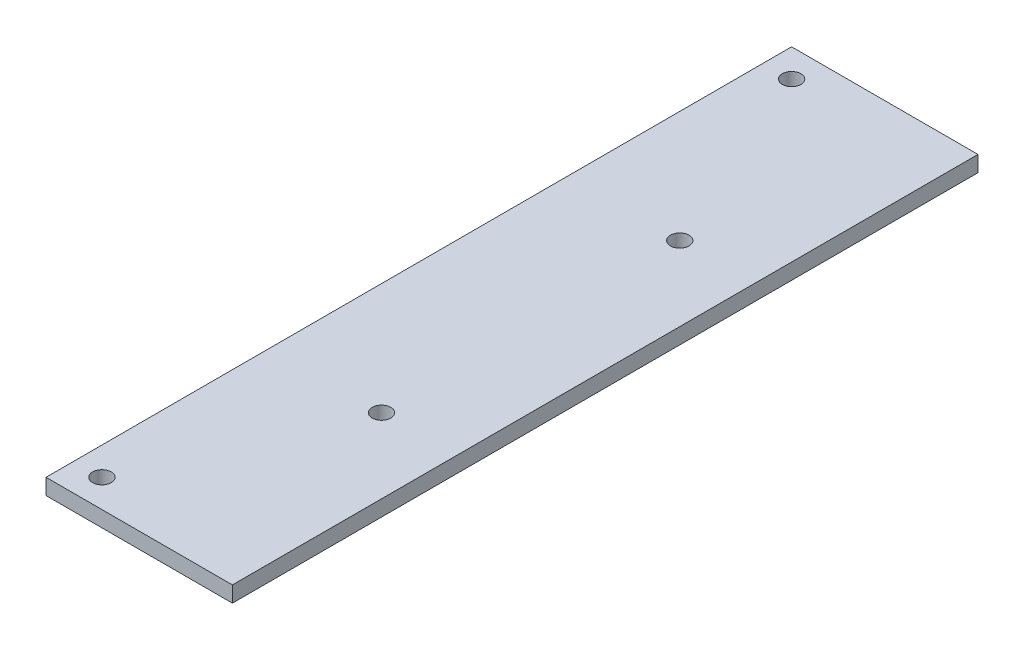
ISO-10303-21;
HEADER;
FILE_DESCRIPTION(('STEP AP214'),'2;1');
FILE_NAME('part.step','',(''),(''),'','','');
FILE_SCHEMA(('AUTOMOTIVE_DESIGN { 1 0 10303 214 1 1 1 1 }'));
ENDSEC;
DATA;
#1=APPLICATION_CONTEXT('core data for automotive mechanical design processes');
#2=APPLICATION_PROTOCOL_DEFINITION('international standard','automotive_design',2000,#1);
#3=PRODUCT_CONTEXT('',#1,'mechanical');
#4=PRODUCT('Part','Part','',(#3));
#5=PRODUCT_RELATED_PRODUCT_CATEGORY('part','',(#4));
#6=PRODUCT_DEFINITION_FORMATION('','',#4);
#7=PRODUCT_DEFINITION_CONTEXT('part definition',#1,'design');
#8=PRODUCT_DEFINITION('design','',#6,#7);
#9=PRODUCT_DEFINITION_SHAPE('','',#8);
#10=(LENGTH_UNIT() NAMED_UNIT(*) SI_UNIT(.MILLI.,.METRE.));
#11=(NAMED_UNIT(*) PLANE_ANGLE_UNIT() SI_UNIT($,.RADIAN.));
#12=(NAMED_UNIT(*) SI_UNIT($,.STERADIAN.) SOLID_ANGLE_UNIT());
#13=UNCERTAINTY_MEASURE_WITH_UNIT(LENGTH_MEASURE(1.E-05),#10,'distance_accuracy_value','');
#14=(GEOMETRIC_REPRESENTATION_CONTEXT(3) GLOBAL_UNCERTAINTY_ASSIGNED_CONTEXT((#13)) GLOBAL_UNIT_ASSIGNED_CONTEXT((#10,
#11,#12)) REPRESENTATION_CONTEXT('',''));
#15=CARTESIAN_POINT('',(0.,0.,0.));
#16=DIRECTION('',(0.,0.,1.));
#17=DIRECTION('',(1.,0.,0.));
#18=AXIS2_PLACEMENT_3D('',#15,#16,#17);
#19=CARTESIAN_POINT('',(0.,1.7,0.));
#20=DIRECTION('',(0.,-1.,0.));
#21=DIRECTION('',(0.,0.,-1.));
#22=AXIS2_PLACEMENT_3D('',#19,#20,#21);
#23=PLANE('',#22);
#24=DIRECTION('',(0.,0.,-1.));
#25=VECTOR('',#24,1.);
#26=CARTESIAN_POINT('',(9.99999999999999,1.7,40.));
#27=LINE('',#26,#25);
#28=CARTESIAN_POINT('',(9.99999999999999,1.7,40.));
#29=VERTEX_POINT('',#28);
#30=CARTESIAN_POINT('',(9.99999999999999,1.7,-40.));
#31=VERTEX_POINT('',#30);
#32=EDGE_CURVE('E158',#29,#31,#27,.T.);
#33=ORIENTED_EDGE('',*,*,#32,.T.);
#34=DIRECTION('',(-1.,0.,0.));
#35=VECTOR('',#34,1.);
#36=CARTESIAN_POINT('',(-10.,1.7,-40.));
#37=LINE('',#36,#35);
#38=CARTESIAN_POINT('',(-10.,1.7,-40.));
#39=VERTEX_POINT('',#38);
#40=EDGE_CURVE('E161',#31,#39,#37,.T.);
#41=ORIENTED_EDGE('',*,*,#40,.T.);
#42=DIRECTION('',(0.,0.,1.));
#43=VECTOR('',#42,1.);
#44=CARTESIAN_POINT('',(-10.,1.7,40.));
#45=LINE('',#44,#43);
#46=CARTESIAN_POINT('',(-10.,1.7,40.));
#47=VERTEX_POINT('',#46);
#48=EDGE_CURVE('E164',#39,#47,#45,.T.);
#49=ORIENTED_EDGE('',*,*,#48,.T.);
#50=DIRECTION('',(1.,0.,0.));
#51=VECTOR('',#50,1.);
#52=CARTESIAN_POINT('',(-10.,1.7,40.));
#53=LINE('',#52,#51);
#54=EDGE_CURVE('E166',#47,#29,#53,.T.);
#55=ORIENTED_EDGE('',*,*,#54,.T.);
#56=EDGE_LOOP('',(#33,#41,#49,#55));
#57=FACE_BOUND('',#56,.T.);
#58=CARTESIAN_POINT('',(2.,1.7,-16.));
#59=DIRECTION('',(0.,1.,0.));
#60=DIRECTION('',(0.,0.,1.));
#61=AXIS2_PLACEMENT_3D('',#58,#59,#60);
#62=CIRCLE('',#61,0.999999999999998);
#63=CARTESIAN_POINT('',(2.,1.7,-15.));
#64=VERTEX_POINT('',#63);
#65=EDGE_CURVE('E152',#64,#64,#62,.T.);
#66=ORIENTED_EDGE('',*,*,#65,.F.);
#67=EDGE_LOOP('',(#66));
#68=FACE_BOUND('',#67,.T.);
#69=CARTESIAN_POINT('',(2.,1.7,16.));
#70=DIRECTION('',(0.,1.,0.));
#71=DIRECTION('',(0.,0.,1.));
#72=AXIS2_PLACEMENT_3D('',#69,#70,#71);
#73=CIRCLE('',#72,0.999999999999999);
#74=CARTESIAN_POINT('',(2.,1.7,17.));
#75=VERTEX_POINT('',#74);
#76=EDGE_CURVE('E146',#75,#75,#73,.T.);
#77=ORIENTED_EDGE('',*,*,#76,.F.);
#78=EDGE_LOOP('',(#77));
#79=FACE_BOUND('',#78,.T.);
#80=CARTESIAN_POINT('',(-7.,1.7,-37.));
#81=DIRECTION('',(0.,1.,0.));
#82=DIRECTION('',(0.,0.,1.));
#83=AXIS2_PLACEMENT_3D('',#80,#81,#82);
#84=CIRCLE('',#83,0.999999999999998);
#85=CARTESIAN_POINT('',(-7.,1.7,-36.));
#86=VERTEX_POINT('',#85);
#87=EDGE_CURVE('E140',#86,#86,#84,.T.);
#88=ORIENTED_EDGE('',*,*,#87,.F.);
#89=EDGE_LOOP('',(#88));
#90=FACE_BOUND('',#89,.T.);
#91=CARTESIAN_POINT('',(-7.,1.7,37.));
#92=DIRECTION('',(0.,1.,0.));
#93=DIRECTION('',(0.,0.,1.));
#94=AXIS2_PLACEMENT_3D('',#91,#92,#93);
#95=CIRCLE('',#94,0.999999999999998);
#96=CARTESIAN_POINT('',(-7.,1.7,38.));
#97=VERTEX_POINT('',#96);
#98=EDGE_CURVE('E131',#97,#97,#95,.T.);
#99=ORIENTED_EDGE('',*,*,#98,.F.);
#100=EDGE_LOOP('',(#99));
#101=FACE_BOUND('',#100,.T.);
#102=ADVANCED_FACE('F39',(#57,#68,#79,#90,#101),#23,.F.);
#103=CARTESIAN_POINT('',(0.,0.,0.));
#104=DIRECTION('',(0.,-1.,0.));
#105=DIRECTION('',(0.,0.,-1.));
#106=AXIS2_PLACEMENT_3D('',#103,#104,#105);
#107=PLANE('',#106);
#108=DIRECTION('',(-1.,0.,0.));
#109=VECTOR('',#108,1.);
#110=CARTESIAN_POINT('',(-10.,0.,5.6));
#111=LINE('',#110,#109);
#112=CARTESIAN_POINT('',(-4.6,0.,5.6));
#113=VERTEX_POINT('',#112);
#114=CARTESIAN_POINT('',(-10.,0.,5.6));
#115=VERTEX_POINT('',#114);
#116=EDGE_CURVE('E54',#113,#115,#111,.T.);
#117=ORIENTED_EDGE('',*,*,#116,.F.);
#118=DIRECTION('',(0.,0.,1.));
#119=VECTOR('',#118,1.);
#120=CARTESIAN_POINT('',(-4.6,0.,5.6));
#121=LINE('',#120,#119);
#122=CARTESIAN_POINT('',(-4.6,0.,-5.6));
#123=VERTEX_POINT('',#122);
#124=EDGE_CURVE('E187',#123,#113,#121,.T.);
#125=ORIENTED_EDGE('',*,*,#124,.F.);
#126=DIRECTION('',(1.,0.,0.));
#127=VECTOR('',#126,1.);
#128=CARTESIAN_POINT('',(-10.,0.,-5.6));
#129=LINE('',#128,#127);
#130=CARTESIAN_POINT('',(-10.,0.,-5.6));
#131=VERTEX_POINT('',#130);
#132=EDGE_CURVE('E186',#131,#123,#129,.T.);
#133=ORIENTED_EDGE('',*,*,#132,.F.);
#134=DIRECTION('',(0.,0.,1.));
#135=VECTOR('',#134,1.);
#136=CARTESIAN_POINT('',(-10.,0.,40.));
#137=LINE('',#136,#135);
#138=CARTESIAN_POINT('',(-10.,0.,-40.));
#139=VERTEX_POINT('',#138);
#140=EDGE_CURVE('E127',#139,#131,#137,.T.);
#141=ORIENTED_EDGE('',*,*,#140,.F.);
#142=DIRECTION('',(-1.,0.,0.));
#143=VECTOR('',#142,1.);
#144=CARTESIAN_POINT('',(-10.,0.,-40.));
#145=LINE('',#144,#143);
#146=CARTESIAN_POINT('',(9.99999999999999,0.,-40.));
#147=VERTEX_POINT('',#146);
#148=EDGE_CURVE('E171',#147,#139,#145,.T.);
#149=ORIENTED_EDGE('',*,*,#148,.F.);
#150=DIRECTION('',(0.,0.,-1.));
#151=VECTOR('',#150,1.);
#152=CARTESIAN_POINT('',(9.99999999999999,0.,40.));
#153=LINE('',#152,#151);
#154=CARTESIAN_POINT('',(9.99999999999999,0.,40.));
#155=VERTEX_POINT('',#154);
#156=EDGE_CURVE('E155',#155,#147,#153,.T.);
#157=ORIENTED_EDGE('',*,*,#156,.F.);
#158=DIRECTION('',(1.,0.,0.));
#159=VECTOR('',#158,1.);
#160=CARTESIAN_POINT('',(-10.,0.,40.));
#161=LINE('',#160,#159);
#162=CARTESIAN_POINT('',(-10.,0.,40.));
#163=VERTEX_POINT('',#162);
#164=EDGE_CURVE('E162',#163,#155,#161,.T.);
#165=ORIENTED_EDGE('',*,*,#164,.F.);
#166=EDGE_CURVE('E59',#115,#163,#137,.T.);
#167=ORIENTED_EDGE('',*,*,#166,.F.);
#168=EDGE_LOOP('',(#117,#125,#133,#141,#149,#157,#165,#167));
#169=FACE_BOUND('',#168,.T.);
#170=CARTESIAN_POINT('',(-7.,0.,-37.));
#171=DIRECTION('',(0.,1.,0.));
#172=DIRECTION('',(0.,0.,1.));
#173=AXIS2_PLACEMENT_3D('',#170,#171,#172);
#174=CIRCLE('',#173,0.999999999999998);
#175=CARTESIAN_POINT('',(-7.,0.,-36.));
#176=VERTEX_POINT('',#175);
#177=EDGE_CURVE('E138',#176,#176,#174,.T.);
#178=ORIENTED_EDGE('',*,*,#177,.T.);
#179=EDGE_LOOP('',(#178));
#180=FACE_BOUND('',#179,.T.);
#181=CARTESIAN_POINT('',(2.,0.,-16.));
#182=DIRECTION('',(0.,1.,0.));
#183=DIRECTION('',(0.,0.,1.));
#184=AXIS2_PLACEMENT_3D('',#181,#182,#183);
#185=CIRCLE('',#184,0.999999999999998);
#186=CARTESIAN_POINT('',(2.,0.,-15.));
#187=VERTEX_POINT('',#186);
#188=EDGE_CURVE('E149',#187,#187,#185,.T.);
#189=ORIENTED_EDGE('',*,*,#188,.T.);
#190=EDGE_LOOP('',(#189));
#191=FACE_BOUND('',#190,.T.);
#192=CARTESIAN_POINT('',(2.,0.,16.));
#193=DIRECTION('',(0.,1.,0.));
#194=DIRECTION('',(0.,0.,1.));
#195=AXIS2_PLACEMENT_3D('',#192,#193,#194);
#196=CIRCLE('',#195,0.999999999999999);
#197=CARTESIAN_POINT('',(2.,0.,17.));
#198=VERTEX_POINT('',#197);
#199=EDGE_CURVE('E143',#198,#198,#196,.T.);
#200=ORIENTED_EDGE('',*,*,#199,.T.);
#201=EDGE_LOOP('',(#200));
#202=FACE_BOUND('',#201,.T.);
#203=CARTESIAN_POINT('',(-7.,0.,37.));
#204=DIRECTION('',(0.,1.,0.));
#205=DIRECTION('',(0.,0.,1.));
#206=AXIS2_PLACEMENT_3D('',#203,#204,#205);
#207=CIRCLE('',#206,0.999999999999998);
#208=CARTESIAN_POINT('',(-7.,0.,38.));
#209=VERTEX_POINT('',#208);
#210=EDGE_CURVE('E128',#209,#209,#207,.T.);
#211=ORIENTED_EDGE('',*,*,#210,.T.);
#212=EDGE_LOOP('',(#211));
#213=FACE_BOUND('',#212,.T.);
#214=ADVANCED_FACE('F183',(#169,#180,#191,#202,#213),#107,.T.);
#215=CARTESIAN_POINT('',(9.99999999999999,1.7,40.));
#216=DIRECTION('',(-1.,0.,0.));
#217=DIRECTION('',(0.,0.,1.));
#218=AXIS2_PLACEMENT_3D('',#215,#216,#217);
#219=PLANE('',#218);
#220=ORIENTED_EDGE('',*,*,#156,.T.);
#221=DIRECTION('',(0.,-1.,0.));
#222=VECTOR('',#221,1.);
#223=CARTESIAN_POINT('',(9.99999999999999,1.7,-40.));
#224=LINE('',#223,#222);
#225=EDGE_CURVE('E11',#31,#147,#224,.T.);
#226=ORIENTED_EDGE('',*,*,#225,.F.);
#227=ORIENTED_EDGE('',*,*,#32,.F.);
#228=DIRECTION('',(0.,-1.,0.));
#229=VECTOR('',#228,1.);
#230=CARTESIAN_POINT('',(9.99999999999999,1.7,40.));
#231=LINE('',#230,#229);
#232=EDGE_CURVE('E168',#29,#155,#231,.T.);
#233=ORIENTED_EDGE('',*,*,#232,.T.);
#234=EDGE_LOOP('',(#220,#226,#227,#233));
#235=FACE_BOUND('',#234,.T.);
#236=ADVANCED_FACE('F41',(#235),#219,.F.);
#237=CARTESIAN_POINT('',(-10.,1.7,-40.));
#238=DIRECTION('',(0.,0.,1.));
#239=DIRECTION('',(1.,0.,0.));
#240=AXIS2_PLACEMENT_3D('',#237,#238,#239);
#241=PLANE('',#240);
#242=ORIENTED_EDGE('',*,*,#148,.T.);
#243=DIRECTION('',(0.,-1.,0.));
#244=VECTOR('',#243,1.);
#245=CARTESIAN_POINT('',(-10.,1.7,-40.));
#246=LINE('',#245,#244);
#247=EDGE_CURVE('E47',#39,#139,#246,.T.);
#248=ORIENTED_EDGE('',*,*,#247,.F.);
#249=ORIENTED_EDGE('',*,*,#40,.F.);
#250=ORIENTED_EDGE('',*,*,#225,.T.);
#251=EDGE_LOOP('',(#242,#248,#249,#250));
#252=FACE_BOUND('',#251,.T.);
#253=ADVANCED_FACE('F227',(#252),#241,.F.);
#254=CARTESIAN_POINT('',(-10.,1.7,40.));
#255=DIRECTION('',(1.,0.,0.));
#256=DIRECTION('',(0.,0.,-1.));
#257=AXIS2_PLACEMENT_3D('',#254,#255,#256);
#258=PLANE('',#257);
#259=ORIENTED_EDGE('',*,*,#140,.T.);
#260=DIRECTION('',(0.,1.,0.));
#261=VECTOR('',#260,1.);
#262=CARTESIAN_POINT('',(-10.,-2.,-5.6));
#263=LINE('',#262,#261);
#264=CARTESIAN_POINT('',(-10.,-2.,-5.6));
#265=VERTEX_POINT('',#264);
#266=EDGE_CURVE('E107',#265,#131,#263,.T.);
#267=ORIENTED_EDGE('',*,*,#266,.F.);
#268=DIRECTION('',(0.,0.,-1.));
#269=VECTOR('',#268,1.);
#270=CARTESIAN_POINT('',(-10.,-2.,5.6));
#271=LINE('',#270,#269);
#272=CARTESIAN_POINT('',(-10.,-2.,5.6));
#273=VERTEX_POINT('',#272);
#274=EDGE_CURVE('E113',#273,#265,#271,.T.);
#275=ORIENTED_EDGE('',*,*,#274,.F.);
#276=DIRECTION('',(0.,1.,0.));
#277=VECTOR('',#276,1.);
#278=CARTESIAN_POINT('',(-10.,-2.,5.6));
#279=LINE('',#278,#277);
#280=EDGE_CURVE('E194',#273,#115,#279,.T.);
#281=ORIENTED_EDGE('',*,*,#280,.T.);
#282=ORIENTED_EDGE('',*,*,#166,.T.);
#283=DIRECTION('',(0.,-1.,0.));
#284=VECTOR('',#283,1.);
#285=CARTESIAN_POINT('',(-10.,1.7,40.));
#286=LINE('',#285,#284);
#287=EDGE_CURVE('E177',#47,#163,#286,.T.);
#288=ORIENTED_EDGE('',*,*,#287,.F.);
#289=ORIENTED_EDGE('',*,*,#48,.F.);
#290=ORIENTED_EDGE('',*,*,#247,.T.);
#291=EDGE_LOOP('',(#259,#267,#275,#281,#282,#288,#289,#290));
#292=FACE_BOUND('',#291,.T.);
#293=ADVANCED_FACE('F124',(#292),#258,.F.);
#294=CARTESIAN_POINT('',(-10.,1.7,40.));
#295=DIRECTION('',(0.,0.,-1.));
#296=DIRECTION('',(-1.,0.,0.));
#297=AXIS2_PLACEMENT_3D('',#294,#295,#296);
#298=PLANE('',#297);
#299=ORIENTED_EDGE('',*,*,#164,.T.);
#300=ORIENTED_EDGE('',*,*,#232,.F.);
#301=ORIENTED_EDGE('',*,*,#54,.F.);
#302=ORIENTED_EDGE('',*,*,#287,.T.);
#303=EDGE_LOOP('',(#299,#300,#301,#302));
#304=FACE_BOUND('',#303,.T.);
#305=ADVANCED_FACE('F222',(#304),#298,.F.);
#306=CARTESIAN_POINT('',(2.,1.7,-16.));
#307=DIRECTION('',(0.,-1.,0.));
#308=DIRECTION('',(0.,0.,-1.));
#309=AXIS2_PLACEMENT_3D('',#306,#307,#308);
#310=CYLINDRICAL_SURFACE('',#309,0.999999999999998);
#311=ORIENTED_EDGE('',*,*,#65,.T.);
#312=EDGE_LOOP('',(#311));
#313=FACE_BOUND('',#312,.T.);
#314=ORIENTED_EDGE('',*,*,#188,.F.);
#315=EDGE_LOOP('',(#314));
#316=FACE_BOUND('',#315,.T.);
#317=ADVANCED_FACE('F219',(#313,#316),#310,.F.);
#318=CARTESIAN_POINT('',(2.,1.7,16.));
#319=DIRECTION('',(0.,-1.,0.));
#320=DIRECTION('',(0.,0.,-1.));
#321=AXIS2_PLACEMENT_3D('',#318,#319,#320);
#322=CYLINDRICAL_SURFACE('',#321,0.999999999999999);
#323=ORIENTED_EDGE('',*,*,#76,.T.);
#324=EDGE_LOOP('',(#323));
#325=FACE_BOUND('',#324,.T.);
#326=ORIENTED_EDGE('',*,*,#199,.F.);
#327=EDGE_LOOP('',(#326));
#328=FACE_BOUND('',#327,.T.);
#329=ADVANCED_FACE('F305',(#325,#328),#322,.F.);
#330=CARTESIAN_POINT('',(-7.,1.7,-37.));
#331=DIRECTION('',(0.,-1.,0.));
#332=DIRECTION('',(0.,0.,-1.));
#333=AXIS2_PLACEMENT_3D('',#330,#331,#332);
#334=CYLINDRICAL_SURFACE('',#333,0.999999999999998);
#335=ORIENTED_EDGE('',*,*,#87,.T.);
#336=EDGE_LOOP('',(#335));
#337=FACE_BOUND('',#336,.T.);
#338=ORIENTED_EDGE('',*,*,#177,.F.);
#339=EDGE_LOOP('',(#338));
#340=FACE_BOUND('',#339,.T.);
#341=ADVANCED_FACE('F296',(#337,#340),#334,.F.);
#342=CARTESIAN_POINT('',(-7.,1.7,37.));
#343=DIRECTION('',(0.,-1.,0.));
#344=DIRECTION('',(0.,0.,-1.));
#345=AXIS2_PLACEMENT_3D('',#342,#343,#344);
#346=CYLINDRICAL_SURFACE('',#345,0.999999999999998);
#347=ORIENTED_EDGE('',*,*,#98,.T.);
#348=EDGE_LOOP('',(#347));
#349=FACE_BOUND('',#348,.T.);
#350=ORIENTED_EDGE('',*,*,#210,.F.);
#351=EDGE_LOOP('',(#350));
#352=FACE_BOUND('',#351,.T.);
#353=ADVANCED_FACE('F208',(#349,#352),#346,.F.);
#354=CARTESIAN_POINT('',(-10.,-2.,-5.6));
#355=DIRECTION('',(0.,0.,1.));
#356=DIRECTION('',(1.,0.,0.));
#357=AXIS2_PLACEMENT_3D('',#354,#355,#356);
#358=PLANE('',#357);
#359=ORIENTED_EDGE('',*,*,#132,.T.);
#360=DIRECTION('',(0.,1.,0.));
#361=VECTOR('',#360,1.);
#362=CARTESIAN_POINT('',(-4.6,-2.,-5.6));
#363=LINE('',#362,#361);
#364=CARTESIAN_POINT('',(-4.6,-2.,-5.6));
#365=VERTEX_POINT('',#364);
#366=EDGE_CURVE('E109',#365,#123,#363,.T.);
#367=ORIENTED_EDGE('',*,*,#366,.F.);
#368=DIRECTION('',(1.,0.,0.));
#369=VECTOR('',#368,1.);
#370=CARTESIAN_POINT('',(-10.,-2.,-5.6));
#371=LINE('',#370,#369);
#372=EDGE_CURVE('E102',#265,#365,#371,.T.);
#373=ORIENTED_EDGE('',*,*,#372,.F.);
#374=ORIENTED_EDGE('',*,*,#266,.T.);
#375=EDGE_LOOP('',(#359,#367,#373,#374));
#376=FACE_BOUND('',#375,.T.);
#377=ADVANCED_FACE('F105',(#376),#358,.F.);
#378=CARTESIAN_POINT('',(-4.6,-2.,5.6));
#379=DIRECTION('',(-1.,0.,0.));
#380=DIRECTION('',(0.,0.,1.));
#381=AXIS2_PLACEMENT_3D('',#378,#379,#380);
#382=PLANE('',#381);
#383=ORIENTED_EDGE('',*,*,#124,.T.);
#384=DIRECTION('',(0.,1.,0.));
#385=VECTOR('',#384,1.);
#386=CARTESIAN_POINT('',(-4.6,-2.,5.6));
#387=LINE('',#386,#385);
#388=CARTESIAN_POINT('',(-4.6,-2.,5.6));
#389=VERTEX_POINT('',#388);
#390=EDGE_CURVE('E133',#389,#113,#387,.T.);
#391=ORIENTED_EDGE('',*,*,#390,.F.);
#392=DIRECTION('',(0.,0.,1.));
#393=VECTOR('',#392,1.);
#394=CARTESIAN_POINT('',(-4.6,-2.,5.6));
#395=LINE('',#394,#393);
#396=EDGE_CURVE('E112',#365,#389,#395,.T.);
#397=ORIENTED_EDGE('',*,*,#396,.F.);
#398=ORIENTED_EDGE('',*,*,#366,.T.);
#399=EDGE_LOOP('',(#383,#391,#397,#398));
#400=FACE_BOUND('',#399,.T.);
#401=ADVANCED_FACE('F200',(#400),#382,.F.);
#402=CARTESIAN_POINT('',(-10.,-2.,5.6));
#403=DIRECTION('',(0.,0.,-1.));
#404=DIRECTION('',(-1.,0.,0.));
#405=AXIS2_PLACEMENT_3D('',#402,#403,#404);
#406=PLANE('',#405);
#407=ORIENTED_EDGE('',*,*,#116,.T.);
#408=ORIENTED_EDGE('',*,*,#280,.F.);
#409=DIRECTION('',(-1.,0.,0.));
#410=VECTOR('',#409,1.);
#411=CARTESIAN_POINT('',(-10.,-2.,5.6));
#412=LINE('',#411,#410);
#413=EDGE_CURVE('E118',#389,#273,#412,.T.);
#414=ORIENTED_EDGE('',*,*,#413,.F.);
#415=ORIENTED_EDGE('',*,*,#390,.T.);
#416=EDGE_LOOP('',(#407,#408,#414,#415));
#417=FACE_BOUND('',#416,.T.);
#418=ADVANCED_FACE('F198',(#417),#406,.F.);
#419=CARTESIAN_POINT('',(0.,-2.,0.));
#420=DIRECTION('',(0.,-1.,0.));
#421=DIRECTION('',(0.,0.,-1.));
#422=AXIS2_PLACEMENT_3D('',#419,#420,#421);
#423=PLANE('',#422);
#424=ORIENTED_EDGE('',*,*,#274,.T.);
#425=ORIENTED_EDGE('',*,*,#372,.T.);
#426=ORIENTED_EDGE('',*,*,#396,.T.);
#427=ORIENTED_EDGE('',*,*,#413,.T.);
#428=EDGE_LOOP('',(#424,#425,#426,#427));
#429=FACE_BOUND('',#428,.T.);
#430=ADVANCED_FACE('F116',(#429),#423,.T.);
#431=CLOSED_SHELL('',(#102,#214,#236,#253,#293,#305,#317,#329,#341,#353,#377,#401,#418,#430));
#432=MANIFOLD_SOLID_BREP('B2',#431);
#433=ADVANCED_BREP_SHAPE_REPRESENTATION('',(#18,#432),#14);
#434=SHAPE_DEFINITION_REPRESENTATION(#9,#433);
ENDSEC;
END-ISO-10303-21;
